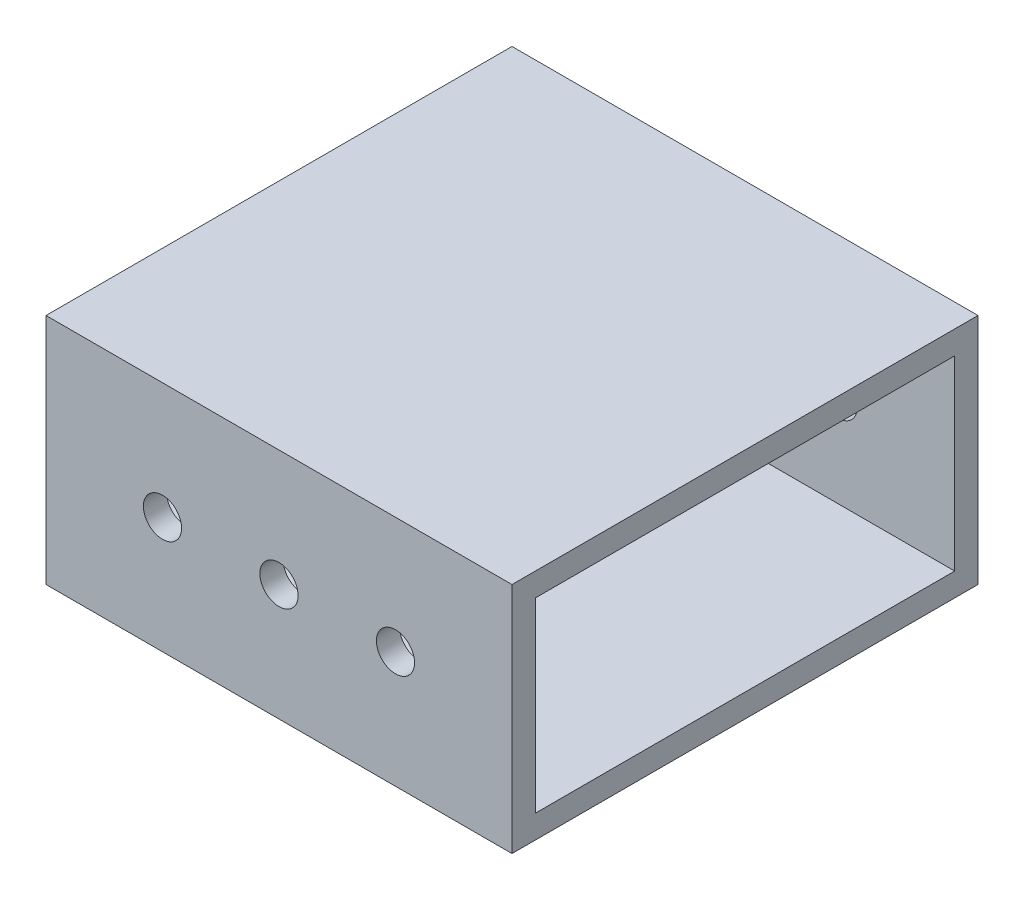
ISO-10303-21;
HEADER;
FILE_DESCRIPTION(('STEP AP214'),'2;1');
FILE_NAME('part.step','',(''),(''),'','','');
FILE_SCHEMA(('AUTOMOTIVE_DESIGN { 1 0 10303 214 1 1 1 1 }'));
ENDSEC;
DATA;
#1=APPLICATION_CONTEXT('core data for automotive mechanical design processes');
#2=APPLICATION_PROTOCOL_DEFINITION('international standard','automotive_design',2000,#1);
#3=PRODUCT_CONTEXT('',#1,'mechanical');
#4=PRODUCT('Part','Part','',(#3));
#5=PRODUCT_RELATED_PRODUCT_CATEGORY('part','',(#4));
#6=PRODUCT_DEFINITION_FORMATION('','',#4);
#7=PRODUCT_DEFINITION_CONTEXT('part definition',#1,'design');
#8=PRODUCT_DEFINITION('design','',#6,#7);
#9=PRODUCT_DEFINITION_SHAPE('','',#8);
#10=(LENGTH_UNIT() NAMED_UNIT(*) SI_UNIT(.MILLI.,.METRE.));
#11=(NAMED_UNIT(*) PLANE_ANGLE_UNIT() SI_UNIT($,.RADIAN.));
#12=(NAMED_UNIT(*) SI_UNIT($,.STERADIAN.) SOLID_ANGLE_UNIT());
#13=UNCERTAINTY_MEASURE_WITH_UNIT(LENGTH_MEASURE(1.E-05),#10,'distance_accuracy_value','');
#14=(GEOMETRIC_REPRESENTATION_CONTEXT(3) GLOBAL_UNCERTAINTY_ASSIGNED_CONTEXT((#13)) GLOBAL_UNIT_ASSIGNED_CONTEXT((#10,
#11,#12)) REPRESENTATION_CONTEXT('',''));
#15=CARTESIAN_POINT('',(0.,0.,0.));
#16=DIRECTION('',(0.,0.,1.));
#17=DIRECTION('',(1.,0.,0.));
#18=AXIS2_PLACEMENT_3D('',#15,#16,#17);
#19=CARTESIAN_POINT('',(12.7,0.,0.));
#20=DIRECTION('',(0.,0.,1.));
#21=DIRECTION('',(1.,0.,0.));
#22=AXIS2_PLACEMENT_3D('',#19,#20,#21);
#23=CYLINDRICAL_SURFACE('',#22,2.0828);
#24=CARTESIAN_POINT('',(12.7,0.,25.4));
#25=DIRECTION('',(0.,0.,1.));
#26=DIRECTION('',(1.,0.,0.));
#27=AXIS2_PLACEMENT_3D('',#24,#25,#26);
#28=CIRCLE('',#27,2.0828);
#29=CARTESIAN_POINT('',(14.7828,0.,25.4));
#30=VERTEX_POINT('',#29);
#31=EDGE_CURVE('E135',#30,#30,#28,.F.);
#32=ORIENTED_EDGE('',*,*,#31,.F.);
#33=EDGE_LOOP('',(#32));
#34=FACE_BOUND('',#33,.T.);
#35=CARTESIAN_POINT('',(12.7,0.,22.86));
#36=DIRECTION('',(0.,0.,1.));
#37=DIRECTION('',(1.,0.,0.));
#38=AXIS2_PLACEMENT_3D('',#35,#36,#37);
#39=CIRCLE('',#38,2.0828);
#40=CARTESIAN_POINT('',(14.7828,0.,22.86));
#41=VERTEX_POINT('',#40);
#42=EDGE_CURVE('E19',#41,#41,#39,.F.);
#43=ORIENTED_EDGE('',*,*,#42,.T.);
#44=EDGE_LOOP('',(#43));
#45=FACE_BOUND('',#44,.T.);
#46=ADVANCED_FACE('F16',(#34,#45),#23,.F.);
#47=CARTESIAN_POINT('',(0.,0.,0.));
#48=DIRECTION('',(0.,0.,1.));
#49=DIRECTION('',(1.,0.,0.));
#50=AXIS2_PLACEMENT_3D('',#47,#48,#49);
#51=CYLINDRICAL_SURFACE('',#50,2.0828);
#52=CARTESIAN_POINT('',(0.,0.,25.4));
#53=DIRECTION('',(0.,0.,1.));
#54=DIRECTION('',(1.,0.,0.));
#55=AXIS2_PLACEMENT_3D('',#52,#53,#54);
#56=CIRCLE('',#55,2.0828);
#57=CARTESIAN_POINT('',(2.0828,0.,25.4));
#58=VERTEX_POINT('',#57);
#59=EDGE_CURVE('E132',#58,#58,#56,.F.);
#60=ORIENTED_EDGE('',*,*,#59,.F.);
#61=EDGE_LOOP('',(#60));
#62=FACE_BOUND('',#61,.T.);
#63=CARTESIAN_POINT('',(0.,0.,22.86));
#64=DIRECTION('',(0.,0.,1.));
#65=DIRECTION('',(1.,0.,0.));
#66=AXIS2_PLACEMENT_3D('',#63,#64,#65);
#67=CIRCLE('',#66,2.0828);
#68=CARTESIAN_POINT('',(2.0828,0.,22.86));
#69=VERTEX_POINT('',#68);
#70=EDGE_CURVE('E144',#69,#69,#67,.F.);
#71=ORIENTED_EDGE('',*,*,#70,.T.);
#72=EDGE_LOOP('',(#71));
#73=FACE_BOUND('',#72,.T.);
#74=ADVANCED_FACE('F164',(#62,#73),#51,.F.);
#75=CARTESIAN_POINT('',(-12.7,0.,0.));
#76=DIRECTION('',(0.,0.,1.));
#77=DIRECTION('',(1.,0.,0.));
#78=AXIS2_PLACEMENT_3D('',#75,#76,#77);
#79=CYLINDRICAL_SURFACE('',#78,2.0828);
#80=CARTESIAN_POINT('',(-12.7,0.,25.4));
#81=DIRECTION('',(0.,0.,1.));
#82=DIRECTION('',(1.,0.,0.));
#83=AXIS2_PLACEMENT_3D('',#80,#81,#82);
#84=CIRCLE('',#83,2.0828);
#85=CARTESIAN_POINT('',(-10.6172,0.,25.4));
#86=VERTEX_POINT('',#85);
#87=EDGE_CURVE('E128',#86,#86,#84,.F.);
#88=ORIENTED_EDGE('',*,*,#87,.F.);
#89=EDGE_LOOP('',(#88));
#90=FACE_BOUND('',#89,.T.);
#91=CARTESIAN_POINT('',(-12.7,0.,22.86));
#92=DIRECTION('',(0.,0.,1.));
#93=DIRECTION('',(1.,0.,0.));
#94=AXIS2_PLACEMENT_3D('',#91,#92,#93);
#95=CIRCLE('',#94,2.0828);
#96=CARTESIAN_POINT('',(-10.6172,0.,22.86));
#97=VERTEX_POINT('',#96);
#98=EDGE_CURVE('E117',#97,#97,#95,.F.);
#99=ORIENTED_EDGE('',*,*,#98,.T.);
#100=EDGE_LOOP('',(#99));
#101=FACE_BOUND('',#100,.T.);
#102=ADVANCED_FACE('F154',(#90,#101),#79,.F.);
#103=CARTESIAN_POINT('',(25.4,-10.16,22.86));
#104=DIRECTION('',(0.,0.,1.));
#105=DIRECTION('',(0.,-1.,0.));
#106=AXIS2_PLACEMENT_3D('',#103,#104,#105);
#107=PLANE('',#106);
#108=DIRECTION('',(1.,0.,0.));
#109=VECTOR('',#108,1.);
#110=CARTESIAN_POINT('',(25.4,-10.16,22.86));
#111=LINE('',#110,#109);
#112=CARTESIAN_POINT('',(25.4,-10.16,22.86));
#113=VERTEX_POINT('',#112);
#114=CARTESIAN_POINT('',(-25.4,-10.16,22.86));
#115=VERTEX_POINT('',#114);
#116=EDGE_CURVE('E115',#113,#115,#111,.F.);
#117=ORIENTED_EDGE('',*,*,#116,.T.);
#118=DIRECTION('',(0.,1.,0.));
#119=VECTOR('',#118,1.);
#120=CARTESIAN_POINT('',(-25.4,12.7,22.86));
#121=LINE('',#120,#119);
#122=CARTESIAN_POINT('',(-25.4,10.16,22.86));
#123=VERTEX_POINT('',#122);
#124=EDGE_CURVE('E86',#123,#115,#121,.F.);
#125=ORIENTED_EDGE('',*,*,#124,.F.);
#126=DIRECTION('',(1.,0.,0.));
#127=VECTOR('',#126,1.);
#128=CARTESIAN_POINT('',(25.4,10.16,22.86));
#129=LINE('',#128,#127);
#130=CARTESIAN_POINT('',(25.4,10.16,22.86));
#131=VERTEX_POINT('',#130);
#132=EDGE_CURVE('E81',#123,#131,#129,.T.);
#133=ORIENTED_EDGE('',*,*,#132,.T.);
#134=DIRECTION('',(0.,1.,0.));
#135=VECTOR('',#134,1.);
#136=CARTESIAN_POINT('',(25.4,-12.7,22.86));
#137=LINE('',#136,#135);
#138=EDGE_CURVE('E78',#113,#131,#137,.T.);
#139=ORIENTED_EDGE('',*,*,#138,.F.);
#140=EDGE_LOOP('',(#117,#125,#133,#139));
#141=FACE_BOUND('',#140,.T.);
#142=ORIENTED_EDGE('',*,*,#98,.F.);
#143=EDGE_LOOP('',(#142));
#144=FACE_BOUND('',#143,.T.);
#145=ORIENTED_EDGE('',*,*,#70,.F.);
#146=EDGE_LOOP('',(#145));
#147=FACE_BOUND('',#146,.T.);
#148=ORIENTED_EDGE('',*,*,#42,.F.);
#149=EDGE_LOOP('',(#148));
#150=FACE_BOUND('',#149,.T.);
#151=ADVANCED_FACE('F83',(#141,#144,#147,#150),#107,.F.);
#152=CARTESIAN_POINT('',(25.4,-10.16,-22.86));
#153=DIRECTION('',(0.,-1.,0.));
#154=DIRECTION('',(0.,0.,-1.));
#155=AXIS2_PLACEMENT_3D('',#152,#153,#154);
#156=PLANE('',#155);
#157=DIRECTION('',(-1.,0.,0.));
#158=VECTOR('',#157,1.);
#159=CARTESIAN_POINT('',(25.4,-10.16,-22.86));
#160=LINE('',#159,#158);
#161=CARTESIAN_POINT('',(25.4,-10.16,-22.86));
#162=VERTEX_POINT('',#161);
#163=CARTESIAN_POINT('',(-25.4,-10.16,-22.86));
#164=VERTEX_POINT('',#163);
#165=EDGE_CURVE('E113',#162,#164,#160,.T.);
#166=ORIENTED_EDGE('',*,*,#165,.T.);
#167=DIRECTION('',(0.,0.,1.));
#168=VECTOR('',#167,1.);
#169=CARTESIAN_POINT('',(-25.4,-10.16,0.));
#170=LINE('',#169,#168);
#171=EDGE_CURVE('E235',#115,#164,#170,.F.);
#172=ORIENTED_EDGE('',*,*,#171,.F.);
#173=ORIENTED_EDGE('',*,*,#116,.F.);
#174=DIRECTION('',(0.,0.,-1.));
#175=VECTOR('',#174,1.);
#176=CARTESIAN_POINT('',(25.4,-10.16,0.));
#177=LINE('',#176,#175);
#178=EDGE_CURVE('E104',#162,#113,#177,.F.);
#179=ORIENTED_EDGE('',*,*,#178,.F.);
#180=EDGE_LOOP('',(#166,#172,#173,#179));
#181=FACE_BOUND('',#180,.T.);
#182=ADVANCED_FACE('F153',(#181),#156,.F.);
#183=CARTESIAN_POINT('',(25.4,10.16,-22.86));
#184=DIRECTION('',(0.,0.,-1.));
#185=DIRECTION('',(-1.,0.,0.));
#186=AXIS2_PLACEMENT_3D('',#183,#184,#185);
#187=PLANE('',#186);
#188=DIRECTION('',(1.,0.,0.));
#189=VECTOR('',#188,1.);
#190=CARTESIAN_POINT('',(25.4,10.16,-22.86));
#191=LINE('',#190,#189);
#192=CARTESIAN_POINT('',(25.4,10.16,-22.86));
#193=VERTEX_POINT('',#192);
#194=CARTESIAN_POINT('',(-25.4,10.16,-22.86));
#195=VERTEX_POINT('',#194);
#196=EDGE_CURVE('E91',#193,#195,#191,.F.);
#197=ORIENTED_EDGE('',*,*,#196,.T.);
#198=DIRECTION('',(0.,1.,0.));
#199=VECTOR('',#198,1.);
#200=CARTESIAN_POINT('',(-25.4,12.7,-22.86));
#201=LINE('',#200,#199);
#202=EDGE_CURVE('E228',#164,#195,#201,.T.);
#203=ORIENTED_EDGE('',*,*,#202,.F.);
#204=ORIENTED_EDGE('',*,*,#165,.F.);
#205=DIRECTION('',(0.,1.,0.));
#206=VECTOR('',#205,1.);
#207=CARTESIAN_POINT('',(25.4,-12.7,-22.86));
#208=LINE('',#207,#206);
#209=EDGE_CURVE('E99',#193,#162,#208,.F.);
#210=ORIENTED_EDGE('',*,*,#209,.F.);
#211=EDGE_LOOP('',(#197,#203,#204,#210));
#212=FACE_BOUND('',#211,.T.);
#213=CARTESIAN_POINT('',(-12.7,0.,-22.86));
#214=DIRECTION('',(0.,0.,1.));
#215=DIRECTION('',(1.,0.,0.));
#216=AXIS2_PLACEMENT_3D('',#213,#214,#215);
#217=CIRCLE('',#216,2.0828);
#218=CARTESIAN_POINT('',(-10.6172,0.,-22.86));
#219=VERTEX_POINT('',#218);
#220=EDGE_CURVE('E105',#219,#219,#217,.F.);
#221=ORIENTED_EDGE('',*,*,#220,.T.);
#222=EDGE_LOOP('',(#221));
#223=FACE_BOUND('',#222,.T.);
#224=CARTESIAN_POINT('',(0.,0.,-22.86));
#225=DIRECTION('',(0.,0.,1.));
#226=DIRECTION('',(1.,0.,0.));
#227=AXIS2_PLACEMENT_3D('',#224,#225,#226);
#228=CIRCLE('',#227,2.0828);
#229=CARTESIAN_POINT('',(2.0828,0.,-22.86));
#230=VERTEX_POINT('',#229);
#231=EDGE_CURVE('E108',#230,#230,#228,.F.);
#232=ORIENTED_EDGE('',*,*,#231,.T.);
#233=EDGE_LOOP('',(#232));
#234=FACE_BOUND('',#233,.T.);
#235=CARTESIAN_POINT('',(12.7,0.,-22.86));
#236=DIRECTION('',(0.,0.,1.));
#237=DIRECTION('',(1.,0.,0.));
#238=AXIS2_PLACEMENT_3D('',#235,#236,#237);
#239=CIRCLE('',#238,2.0828);
#240=CARTESIAN_POINT('',(14.7828,0.,-22.86));
#241=VERTEX_POINT('',#240);
#242=EDGE_CURVE('E90',#241,#241,#239,.F.);
#243=ORIENTED_EDGE('',*,*,#242,.T.);
#244=EDGE_LOOP('',(#243));
#245=FACE_BOUND('',#244,.T.);
#246=ADVANCED_FACE('F161',(#212,#223,#234,#245),#187,.F.);
#247=CARTESIAN_POINT('',(25.4,10.16,22.86));
#248=DIRECTION('',(0.,1.,0.));
#249=DIRECTION('',(0.,0.,1.));
#250=AXIS2_PLACEMENT_3D('',#247,#248,#249);
#251=PLANE('',#250);
#252=ORIENTED_EDGE('',*,*,#132,.F.);
#253=DIRECTION('',(0.,0.,1.));
#254=VECTOR('',#253,1.);
#255=CARTESIAN_POINT('',(-25.4,10.16,0.));
#256=LINE('',#255,#254);
#257=EDGE_CURVE('E230',#195,#123,#256,.T.);
#258=ORIENTED_EDGE('',*,*,#257,.F.);
#259=ORIENTED_EDGE('',*,*,#196,.F.);
#260=DIRECTION('',(0.,0.,-1.));
#261=VECTOR('',#260,1.);
#262=CARTESIAN_POINT('',(25.4,10.16,0.));
#263=LINE('',#262,#261);
#264=EDGE_CURVE('E94',#131,#193,#263,.T.);
#265=ORIENTED_EDGE('',*,*,#264,.F.);
#266=EDGE_LOOP('',(#252,#258,#259,#265));
#267=FACE_BOUND('',#266,.T.);
#268=ADVANCED_FACE('F95',(#267),#251,.F.);
#269=CARTESIAN_POINT('',(12.7,0.,0.));
#270=DIRECTION('',(0.,0.,1.));
#271=DIRECTION('',(1.,0.,0.));
#272=AXIS2_PLACEMENT_3D('',#269,#270,#271);
#273=CYLINDRICAL_SURFACE('',#272,2.0828);
#274=ORIENTED_EDGE('',*,*,#242,.F.);
#275=EDGE_LOOP('',(#274));
#276=FACE_BOUND('',#275,.T.);
#277=CARTESIAN_POINT('',(12.7,0.,-25.4));
#278=DIRECTION('',(0.,0.,1.));
#279=DIRECTION('',(1.,0.,0.));
#280=AXIS2_PLACEMENT_3D('',#277,#278,#279);
#281=CIRCLE('',#280,2.0828);
#282=CARTESIAN_POINT('',(14.7828,0.,-25.4));
#283=VERTEX_POINT('',#282);
#284=EDGE_CURVE('E124',#283,#283,#281,.F.);
#285=ORIENTED_EDGE('',*,*,#284,.T.);
#286=EDGE_LOOP('',(#285));
#287=FACE_BOUND('',#286,.T.);
#288=ADVANCED_FACE('F200',(#276,#287),#273,.F.);
#289=CARTESIAN_POINT('',(0.,0.,0.));
#290=DIRECTION('',(0.,0.,1.));
#291=DIRECTION('',(1.,0.,0.));
#292=AXIS2_PLACEMENT_3D('',#289,#290,#291);
#293=CYLINDRICAL_SURFACE('',#292,2.0828);
#294=ORIENTED_EDGE('',*,*,#231,.F.);
#295=EDGE_LOOP('',(#294));
#296=FACE_BOUND('',#295,.T.);
#297=CARTESIAN_POINT('',(0.,0.,-25.4));
#298=DIRECTION('',(0.,0.,1.));
#299=DIRECTION('',(1.,0.,0.));
#300=AXIS2_PLACEMENT_3D('',#297,#298,#299);
#301=CIRCLE('',#300,2.0828);
#302=CARTESIAN_POINT('',(2.0828,0.,-25.4));
#303=VERTEX_POINT('',#302);
#304=EDGE_CURVE('E121',#303,#303,#301,.F.);
#305=ORIENTED_EDGE('',*,*,#304,.T.);
#306=EDGE_LOOP('',(#305));
#307=FACE_BOUND('',#306,.T.);
#308=ADVANCED_FACE('F196',(#296,#307),#293,.F.);
#309=CARTESIAN_POINT('',(-12.7,0.,0.));
#310=DIRECTION('',(0.,0.,1.));
#311=DIRECTION('',(1.,0.,0.));
#312=AXIS2_PLACEMENT_3D('',#309,#310,#311);
#313=CYLINDRICAL_SURFACE('',#312,2.0828);
#314=ORIENTED_EDGE('',*,*,#220,.F.);
#315=EDGE_LOOP('',(#314));
#316=FACE_BOUND('',#315,.T.);
#317=CARTESIAN_POINT('',(-12.7,0.,-25.4));
#318=DIRECTION('',(0.,0.,1.));
#319=DIRECTION('',(1.,0.,0.));
#320=AXIS2_PLACEMENT_3D('',#317,#318,#319);
#321=CIRCLE('',#320,2.0828);
#322=CARTESIAN_POINT('',(-10.6172,0.,-25.4));
#323=VERTEX_POINT('',#322);
#324=EDGE_CURVE('E118',#323,#323,#321,.F.);
#325=ORIENTED_EDGE('',*,*,#324,.T.);
#326=EDGE_LOOP('',(#325));
#327=FACE_BOUND('',#326,.T.);
#328=ADVANCED_FACE('F192',(#316,#327),#313,.F.);
#329=CARTESIAN_POINT('',(25.4,12.7,0.));
#330=DIRECTION('',(0.,1.,0.));
#331=DIRECTION('',(0.,0.,1.));
#332=AXIS2_PLACEMENT_3D('',#329,#330,#331);
#333=PLANE('',#332);
#334=DIRECTION('',(0.,0.,-1.));
#335=VECTOR('',#334,1.);
#336=CARTESIAN_POINT('',(25.4,12.7,0.));
#337=LINE('',#336,#335);
#338=CARTESIAN_POINT('',(25.4,12.7,-25.4));
#339=VERTEX_POINT('',#338);
#340=CARTESIAN_POINT('',(25.4,12.7,25.4));
#341=VERTEX_POINT('',#340);
#342=EDGE_CURVE('E137',#339,#341,#337,.F.);
#343=ORIENTED_EDGE('',*,*,#342,.F.);
#344=DIRECTION('',(1.,0.,0.));
#345=VECTOR('',#344,1.);
#346=CARTESIAN_POINT('',(0.,12.7,-25.4));
#347=LINE('',#346,#345);
#348=CARTESIAN_POINT('',(-25.4,12.7,-25.4));
#349=VERTEX_POINT('',#348);
#350=EDGE_CURVE('E261',#339,#349,#347,.F.);
#351=ORIENTED_EDGE('',*,*,#350,.T.);
#352=DIRECTION('',(0.,0.,1.));
#353=VECTOR('',#352,1.);
#354=CARTESIAN_POINT('',(-25.4,12.7,0.));
#355=LINE('',#354,#353);
#356=CARTESIAN_POINT('',(-25.4,12.7,25.4));
#357=VERTEX_POINT('',#356);
#358=EDGE_CURVE('E127',#357,#349,#355,.F.);
#359=ORIENTED_EDGE('',*,*,#358,.F.);
#360=DIRECTION('',(1.,0.,0.));
#361=VECTOR('',#360,1.);
#362=CARTESIAN_POINT('',(0.,12.7,25.4));
#363=LINE('',#362,#361);
#364=EDGE_CURVE('E131',#341,#357,#363,.F.);
#365=ORIENTED_EDGE('',*,*,#364,.F.);
#366=EDGE_LOOP('',(#343,#351,#359,#365));
#367=FACE_BOUND('',#366,.T.);
#368=ADVANCED_FACE('F188',(#367),#333,.T.);
#369=CARTESIAN_POINT('',(25.4,-12.7,0.));
#370=DIRECTION('',(1.,0.,0.));
#371=DIRECTION('',(0.,0.,-1.));
#372=AXIS2_PLACEMENT_3D('',#369,#370,#371);
#373=PLANE('',#372);
#374=DIRECTION('',(0.,0.,-1.));
#375=VECTOR('',#374,1.);
#376=CARTESIAN_POINT('',(25.4,-12.7,0.));
#377=LINE('',#376,#375);
#378=CARTESIAN_POINT('',(25.4,-12.7,-25.4));
#379=VERTEX_POINT('',#378);
#380=CARTESIAN_POINT('',(25.4,-12.7,25.4));
#381=VERTEX_POINT('',#380);
#382=EDGE_CURVE('E259',#379,#381,#377,.F.);
#383=ORIENTED_EDGE('',*,*,#382,.F.);
#384=DIRECTION('',(0.,1.,0.));
#385=VECTOR('',#384,1.);
#386=CARTESIAN_POINT('',(25.4,0.,-25.4));
#387=LINE('',#386,#385);
#388=EDGE_CURVE('E250',#379,#339,#387,.T.);
#389=ORIENTED_EDGE('',*,*,#388,.T.);
#390=ORIENTED_EDGE('',*,*,#342,.T.);
#391=DIRECTION('',(0.,1.,0.));
#392=VECTOR('',#391,1.);
#393=CARTESIAN_POINT('',(25.4,0.,25.4));
#394=LINE('',#393,#392);
#395=EDGE_CURVE('E241',#381,#341,#394,.T.);
#396=ORIENTED_EDGE('',*,*,#395,.F.);
#397=EDGE_LOOP('',(#383,#389,#390,#396));
#398=FACE_BOUND('',#397,.T.);
#399=ORIENTED_EDGE('',*,*,#209,.T.);
#400=ORIENTED_EDGE('',*,*,#178,.T.);
#401=ORIENTED_EDGE('',*,*,#138,.T.);
#402=ORIENTED_EDGE('',*,*,#264,.T.);
#403=EDGE_LOOP('',(#399,#400,#401,#402));
#404=FACE_BOUND('',#403,.T.);
#405=ADVANCED_FACE('F102',(#398,#404),#373,.T.);
#406=CARTESIAN_POINT('',(0.,0.,25.4));
#407=DIRECTION('',(0.,0.,1.));
#408=DIRECTION('',(1.,0.,0.));
#409=AXIS2_PLACEMENT_3D('',#406,#407,#408);
#410=PLANE('',#409);
#411=DIRECTION('',(1.,0.,0.));
#412=VECTOR('',#411,1.);
#413=CARTESIAN_POINT('',(-25.4,-12.7,25.4));
#414=LINE('',#413,#412);
#415=CARTESIAN_POINT('',(-25.4,-12.7,25.4));
#416=VERTEX_POINT('',#415);
#417=EDGE_CURVE('E256',#381,#416,#414,.F.);
#418=ORIENTED_EDGE('',*,*,#417,.F.);
#419=ORIENTED_EDGE('',*,*,#395,.T.);
#420=ORIENTED_EDGE('',*,*,#364,.T.);
#421=DIRECTION('',(0.,1.,0.));
#422=VECTOR('',#421,1.);
#423=CARTESIAN_POINT('',(-25.4,12.7,25.4));
#424=LINE('',#423,#422);
#425=EDGE_CURVE('E232',#416,#357,#424,.T.);
#426=ORIENTED_EDGE('',*,*,#425,.F.);
#427=EDGE_LOOP('',(#418,#419,#420,#426));
#428=FACE_BOUND('',#427,.T.);
#429=ORIENTED_EDGE('',*,*,#87,.T.);
#430=EDGE_LOOP('',(#429));
#431=FACE_BOUND('',#430,.T.);
#432=ORIENTED_EDGE('',*,*,#59,.T.);
#433=EDGE_LOOP('',(#432));
#434=FACE_BOUND('',#433,.T.);
#435=ORIENTED_EDGE('',*,*,#31,.T.);
#436=EDGE_LOOP('',(#435));
#437=FACE_BOUND('',#436,.T.);
#438=ADVANCED_FACE('F182',(#428,#431,#434,#437),#410,.T.);
#439=CARTESIAN_POINT('',(-25.4,12.7,0.));
#440=DIRECTION('',(-1.,0.,0.));
#441=DIRECTION('',(0.,0.,1.));
#442=AXIS2_PLACEMENT_3D('',#439,#440,#441);
#443=PLANE('',#442);
#444=ORIENTED_EDGE('',*,*,#358,.T.);
#445=DIRECTION('',(0.,1.,0.));
#446=VECTOR('',#445,1.);
#447=CARTESIAN_POINT('',(-25.4,0.,-25.4));
#448=LINE('',#447,#446);
#449=CARTESIAN_POINT('',(-25.4,-12.7,-25.4));
#450=VERTEX_POINT('',#449);
#451=EDGE_CURVE('E34',#349,#450,#448,.F.);
#452=ORIENTED_EDGE('',*,*,#451,.T.);
#453=DIRECTION('',(0.,0.,-1.));
#454=VECTOR('',#453,1.);
#455=CARTESIAN_POINT('',(-25.4,-12.7,0.));
#456=LINE('',#455,#454);
#457=EDGE_CURVE('E25',#416,#450,#456,.T.);
#458=ORIENTED_EDGE('',*,*,#457,.F.);
#459=ORIENTED_EDGE('',*,*,#425,.T.);
#460=EDGE_LOOP('',(#444,#452,#458,#459));
#461=FACE_BOUND('',#460,.T.);
#462=ORIENTED_EDGE('',*,*,#202,.T.);
#463=ORIENTED_EDGE('',*,*,#257,.T.);
#464=ORIENTED_EDGE('',*,*,#124,.T.);
#465=ORIENTED_EDGE('',*,*,#171,.T.);
#466=EDGE_LOOP('',(#462,#463,#464,#465));
#467=FACE_BOUND('',#466,.T.);
#468=ADVANCED_FACE('F175',(#461,#467),#443,.T.);
#469=CARTESIAN_POINT('',(0.,0.,-25.4));
#470=DIRECTION('',(0.,0.,1.));
#471=DIRECTION('',(1.,0.,0.));
#472=AXIS2_PLACEMENT_3D('',#469,#470,#471);
#473=PLANE('',#472);
#474=ORIENTED_EDGE('',*,*,#388,.F.);
#475=DIRECTION('',(1.,0.,0.));
#476=VECTOR('',#475,1.);
#477=CARTESIAN_POINT('',(-25.4,-12.7,-25.4));
#478=LINE('',#477,#476);
#479=EDGE_CURVE('E10',#450,#379,#478,.T.);
#480=ORIENTED_EDGE('',*,*,#479,.F.);
#481=ORIENTED_EDGE('',*,*,#451,.F.);
#482=ORIENTED_EDGE('',*,*,#350,.F.);
#483=EDGE_LOOP('',(#474,#480,#481,#482));
#484=FACE_BOUND('',#483,.T.);
#485=ORIENTED_EDGE('',*,*,#324,.F.);
#486=EDGE_LOOP('',(#485));
#487=FACE_BOUND('',#486,.T.);
#488=ORIENTED_EDGE('',*,*,#304,.F.);
#489=EDGE_LOOP('',(#488));
#490=FACE_BOUND('',#489,.T.);
#491=ORIENTED_EDGE('',*,*,#284,.F.);
#492=EDGE_LOOP('',(#491));
#493=FACE_BOUND('',#492,.T.);
#494=ADVANCED_FACE('F169',(#484,#487,#490,#493),#473,.F.);
#495=CARTESIAN_POINT('',(-25.4,-12.7,0.));
#496=DIRECTION('',(0.,-1.,0.));
#497=DIRECTION('',(0.,0.,-1.));
#498=AXIS2_PLACEMENT_3D('',#495,#496,#497);
#499=PLANE('',#498);
#500=ORIENTED_EDGE('',*,*,#457,.T.);
#501=ORIENTED_EDGE('',*,*,#479,.T.);
#502=ORIENTED_EDGE('',*,*,#382,.T.);
#503=ORIENTED_EDGE('',*,*,#417,.T.);
#504=EDGE_LOOP('',(#500,#501,#502,#503));
#505=FACE_BOUND('',#504,.T.);
#506=ADVANCED_FACE('F167',(#505),#499,.T.);
#507=CLOSED_SHELL('',(#46,#74,#102,#151,#182,#246,#268,#288,#308,#328,#368,#405,#438,#468,#494,#506));
#508=MANIFOLD_SOLID_BREP('B1',#507);
#509=ADVANCED_BREP_SHAPE_REPRESENTATION('',(#18,#508),#14);
#510=SHAPE_DEFINITION_REPRESENTATION(#9,#509);
ENDSEC;
END-ISO-10303-21;
